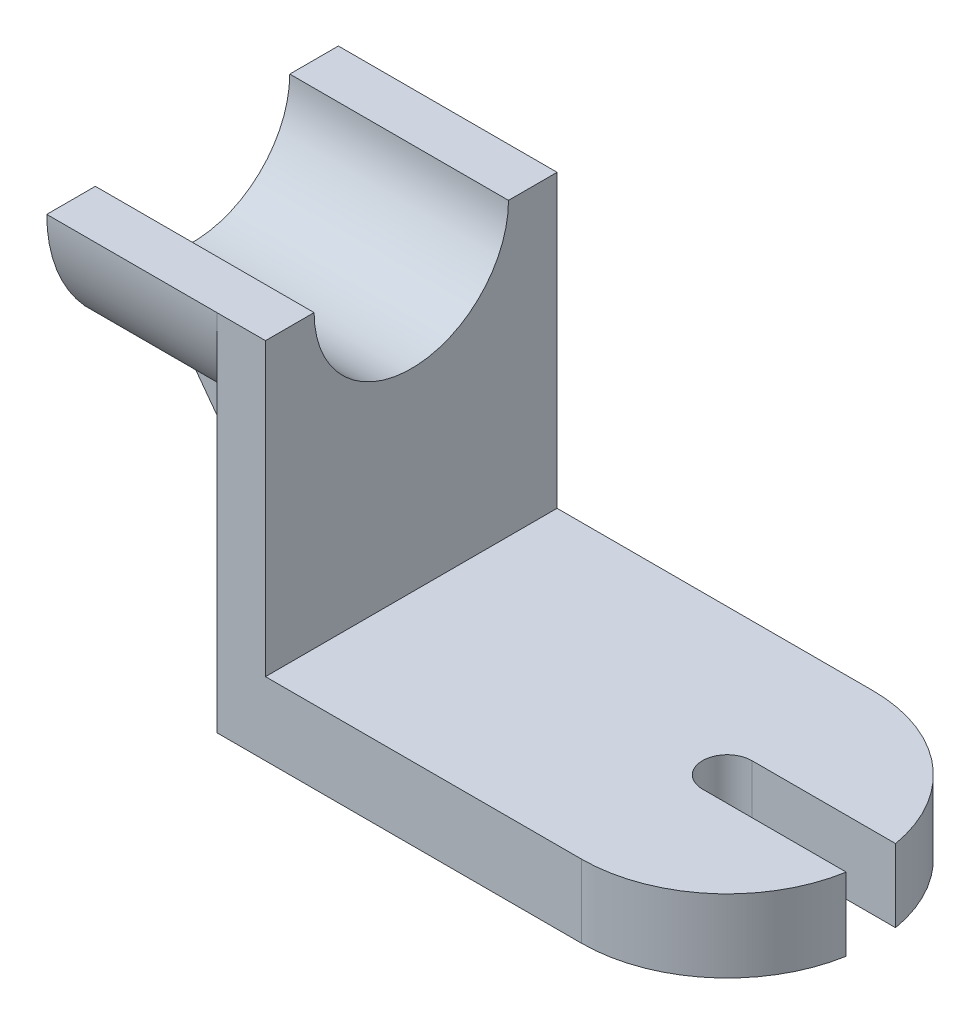
ISO-10303-21;
HEADER;
FILE_DESCRIPTION(('STEP AP214'),'2;1');
FILE_NAME('part.step','',(''),(''),'','','');
FILE_SCHEMA(('AUTOMOTIVE_DESIGN { 1 0 10303 214 1 1 1 1 }'));
ENDSEC;
DATA;
#1=APPLICATION_CONTEXT('core data for automotive mechanical design processes');
#2=APPLICATION_PROTOCOL_DEFINITION('international standard','automotive_design',2000,#1);
#3=PRODUCT_CONTEXT('',#1,'mechanical');
#4=PRODUCT('Part','Part','',(#3));
#5=PRODUCT_RELATED_PRODUCT_CATEGORY('part','',(#4));
#6=PRODUCT_DEFINITION_FORMATION('','',#4);
#7=PRODUCT_DEFINITION_CONTEXT('part definition',#1,'design');
#8=PRODUCT_DEFINITION('design','',#6,#7);
#9=PRODUCT_DEFINITION_SHAPE('','',#8);
#10=(LENGTH_UNIT() NAMED_UNIT(*) SI_UNIT(.MILLI.,.METRE.));
#11=(NAMED_UNIT(*) PLANE_ANGLE_UNIT() SI_UNIT($,.RADIAN.));
#12=(NAMED_UNIT(*) SI_UNIT($,.STERADIAN.) SOLID_ANGLE_UNIT());
#13=UNCERTAINTY_MEASURE_WITH_UNIT(LENGTH_MEASURE(1.E-05),#10,'distance_accuracy_value','');
#14=(GEOMETRIC_REPRESENTATION_CONTEXT(3) GLOBAL_UNCERTAINTY_ASSIGNED_CONTEXT((#13)) GLOBAL_UNIT_ASSIGNED_CONTEXT((#10,
#11,#12)) REPRESENTATION_CONTEXT('',''));
#15=CARTESIAN_POINT('',(0.,0.,0.));
#16=DIRECTION('',(0.,0.,1.));
#17=DIRECTION('',(1.,0.,0.));
#18=AXIS2_PLACEMENT_3D('',#15,#16,#17);
#19=CARTESIAN_POINT('',(-69.85,190.184169005967,-76.2));
#20=DIRECTION('',(0.,1.,0.));
#21=DIRECTION('',(0.,0.,1.));
#22=AXIS2_PLACEMENT_3D('',#19,#20,#21);
#23=PLANE('',#22);
#24=DIRECTION('',(1.,0.,0.));
#25=VECTOR('',#24,1.);
#26=CARTESIAN_POINT('',(-184.163180709959,190.184169005967,-50.8));
#27=LINE('',#26,#25);
#28=CARTESIAN_POINT('',(-184.163180709959,190.184169005967,-50.8));
#29=VERTEX_POINT('',#28);
#30=CARTESIAN_POINT('',(-69.85,190.184169005967,-50.8));
#31=VERTEX_POINT('',#30);
#32=EDGE_CURVE('E300',#29,#31,#27,.T.);
#33=ORIENTED_EDGE('',*,*,#32,.T.);
#34=DIRECTION('',(0.,0.,-1.));
#35=VECTOR('',#34,1.);
#36=CARTESIAN_POINT('',(-69.85,190.184169005967,-76.2));
#37=LINE('',#36,#35);
#38=CARTESIAN_POINT('',(-69.85,190.184169005967,-76.2));
#39=VERTEX_POINT('',#38);
#40=EDGE_CURVE('E172',#31,#39,#37,.T.);
#41=ORIENTED_EDGE('',*,*,#40,.T.);
#42=DIRECTION('',(-1.,0.,0.));
#43=VECTOR('',#42,1.);
#44=CARTESIAN_POINT('',(-69.85,190.184169005967,-76.2));
#45=LINE('',#44,#43);
#46=CARTESIAN_POINT('',(-95.25,190.184169005967,-76.2));
#47=VERTEX_POINT('',#46);
#48=EDGE_CURVE('E186',#39,#47,#45,.T.);
#49=ORIENTED_EDGE('',*,*,#48,.T.);
#50=DIRECTION('',(-1.,0.,0.));
#51=VECTOR('',#50,1.);
#52=CARTESIAN_POINT('',(-95.25,190.184169005967,-76.2));
#53=LINE('',#52,#51);
#54=CARTESIAN_POINT('',(-184.163180709959,190.184169005967,-76.2));
#55=VERTEX_POINT('',#54);
#56=EDGE_CURVE('E294',#47,#55,#53,.T.);
#57=ORIENTED_EDGE('',*,*,#56,.T.);
#58=DIRECTION('',(0.,0.,1.));
#59=VECTOR('',#58,1.);
#60=CARTESIAN_POINT('',(-184.163180709959,190.184169005967,-76.2));
#61=LINE('',#60,#59);
#62=EDGE_CURVE('E297',#55,#29,#61,.T.);
#63=ORIENTED_EDGE('',*,*,#62,.T.);
#64=EDGE_LOOP('',(#33,#41,#49,#57,#63));
#65=FACE_BOUND('',#64,.T.);
#66=ADVANCED_FACE('F32',(#65),#23,.T.);
#67=CARTESIAN_POINT('',(-95.25,38.1,76.2));
#68=DIRECTION('',(1.,0.,0.));
#69=DIRECTION('',(0.,0.,-1.));
#70=AXIS2_PLACEMENT_3D('',#67,#68,#69);
#71=PLANE('',#70);
#72=DIRECTION('',(0.,1.,0.));
#73=VECTOR('',#72,1.);
#74=CARTESIAN_POINT('',(-95.25,0.,12.902875399361));
#75=LINE('',#74,#73);
#76=CARTESIAN_POINT('',(-95.25,0.,12.9028753993611));
#77=VERTEX_POINT('',#76);
#78=CARTESIAN_POINT('',(-95.25,115.084529816231,12.9028753993613));
#79=VERTEX_POINT('',#78);
#80=EDGE_CURVE('E275',#77,#79,#75,.T.);
#81=ORIENTED_EDGE('',*,*,#80,.F.);
#82=DIRECTION('',(0.,0.,1.));
#83=VECTOR('',#82,1.);
#84=CARTESIAN_POINT('',(-95.25,0.,76.2));
#85=LINE('',#84,#83);
#86=CARTESIAN_POINT('',(-95.25,0.,76.2));
#87=VERTEX_POINT('',#86);
#88=EDGE_CURVE('E214',#77,#87,#85,.T.);
#89=ORIENTED_EDGE('',*,*,#88,.T.);
#90=DIRECTION('',(0.,-1.,0.));
#91=VECTOR('',#90,1.);
#92=CARTESIAN_POINT('',(-95.25,38.1,76.2));
#93=LINE('',#92,#91);
#94=CARTESIAN_POINT('',(-95.25,190.184169005967,76.2));
#95=VERTEX_POINT('',#94);
#96=EDGE_CURVE('E238',#95,#87,#93,.T.);
#97=ORIENTED_EDGE('',*,*,#96,.F.);
#98=CARTESIAN_POINT('',(-95.25,190.184169005967,0.));
#99=DIRECTION('',(1.,0.,0.));
#100=DIRECTION('',(0.,0.,-1.));
#101=AXIS2_PLACEMENT_3D('',#98,#99,#100);
#102=CIRCLE('',#101,76.2);
#103=EDGE_CURVE('E274',#95,#79,#102,.T.);
#104=ORIENTED_EDGE('',*,*,#103,.T.);
#105=EDGE_LOOP('',(#81,#89,#97,#104));
#106=FACE_BOUND('',#105,.T.);
#107=ADVANCED_FACE('F273',(#106),#71,.F.);
#108=DIRECTION('',(0.,-1.,0.));
#109=VECTOR('',#108,1.);
#110=CARTESIAN_POINT('',(-95.25,0.,-12.902875399361));
#111=LINE('',#110,#109);
#112=CARTESIAN_POINT('',(-95.25,115.084529816231,-12.902875399361));
#113=VERTEX_POINT('',#112);
#114=CARTESIAN_POINT('',(-95.25,0.,-12.902875399361));
#115=VERTEX_POINT('',#114);
#116=EDGE_CURVE('E277',#113,#115,#111,.T.);
#117=ORIENTED_EDGE('',*,*,#116,.F.);
#118=EDGE_CURVE('E308',#113,#47,#102,.T.);
#119=ORIENTED_EDGE('',*,*,#118,.T.);
#120=DIRECTION('',(0.,-1.,0.));
#121=VECTOR('',#120,1.);
#122=CARTESIAN_POINT('',(-95.25,38.1,-76.2));
#123=LINE('',#122,#121);
#124=CARTESIAN_POINT('',(-95.25,0.,-76.2));
#125=VERTEX_POINT('',#124);
#126=EDGE_CURVE('E241',#47,#125,#123,.T.);
#127=ORIENTED_EDGE('',*,*,#126,.T.);
#128=EDGE_CURVE('E215',#125,#115,#85,.T.);
#129=ORIENTED_EDGE('',*,*,#128,.T.);
#130=EDGE_LOOP('',(#117,#119,#127,#129));
#131=FACE_BOUND('',#130,.T.);
#132=ADVANCED_FACE('F312',(#131),#71,.F.);
#133=CARTESIAN_POINT('',(0.,190.184169005967,0.));
#134=DIRECTION('',(1.,0.,0.));
#135=DIRECTION('',(0.,0.,-1.));
#136=AXIS2_PLACEMENT_3D('',#133,#134,#135);
#137=CYLINDRICAL_SURFACE('',#136,76.2);
#138=CARTESIAN_POINT('',(-184.15,190.184169005967,0.));
#139=DIRECTION('',(-1.,0.,0.));
#140=DIRECTION('',(0.,0.,1.));
#141=AXIS2_PLACEMENT_3D('',#138,#139,#140);
#142=CIRCLE('',#141,76.2);
#143=CARTESIAN_POINT('',(-184.15,115.084529816231,12.902875399361));
#144=VERTEX_POINT('',#143);
#145=CARTESIAN_POINT('',(-184.15,115.084529816231,-12.902875399361));
#146=VERTEX_POINT('',#145);
#147=EDGE_CURVE('E247',#144,#146,#142,.F.);
#148=ORIENTED_EDGE('',*,*,#147,.F.);
#149=DIRECTION('',(1.,0.,0.));
#150=VECTOR('',#149,1.);
#151=CARTESIAN_POINT('',(-184.15,115.084529816231,12.902875399361));
#152=LINE('',#151,#150);
#153=EDGE_CURVE('E292',#144,#79,#152,.T.);
#154=ORIENTED_EDGE('',*,*,#153,.T.);
#155=ORIENTED_EDGE('',*,*,#103,.F.);
#156=DIRECTION('',(-1.,0.,0.));
#157=VECTOR('',#156,1.);
#158=CARTESIAN_POINT('',(-95.25,190.184169005967,76.2));
#159=LINE('',#158,#157);
#160=CARTESIAN_POINT('',(-184.163180709959,190.184169005967,76.2));
#161=VERTEX_POINT('',#160);
#162=EDGE_CURVE('E302',#95,#161,#159,.T.);
#163=ORIENTED_EDGE('',*,*,#162,.T.);
#164=CARTESIAN_POINT('',(-184.163180709959,190.184169005967,0.));
#165=DIRECTION('',(1.,0.,0.));
#166=DIRECTION('',(0.,0.,-1.));
#167=AXIS2_PLACEMENT_3D('',#164,#165,#166);
#168=CIRCLE('',#167,76.2);
#169=EDGE_CURVE('E307',#161,#55,#168,.T.);
#170=ORIENTED_EDGE('',*,*,#169,.T.);
#171=ORIENTED_EDGE('',*,*,#56,.F.);
#172=ORIENTED_EDGE('',*,*,#118,.F.);
#173=DIRECTION('',(1.,0.,0.));
#174=VECTOR('',#173,1.);
#175=CARTESIAN_POINT('',(-184.15,115.084529816231,-12.902875399361));
#176=LINE('',#175,#174);
#177=EDGE_CURVE('E289',#146,#113,#176,.T.);
#178=ORIENTED_EDGE('',*,*,#177,.F.);
#179=EDGE_LOOP('',(#148,#154,#155,#163,#170,#171,#172,#178));
#180=FACE_BOUND('',#179,.T.);
#181=ADVANCED_FACE('F322',(#180),#137,.T.);
#182=CARTESIAN_POINT('',(95.25,38.1,0.));
#183=DIRECTION('',(0.,-1.,0.));
#184=DIRECTION('',(0.,0.,-1.));
#185=AXIS2_PLACEMENT_3D('',#182,#183,#184);
#186=CYLINDRICAL_SURFACE('',#185,76.2);
#187=CARTESIAN_POINT('',(95.25,0.,0.));
#188=DIRECTION('',(0.,1.,0.));
#189=DIRECTION('',(0.,0.,1.));
#190=AXIS2_PLACEMENT_3D('',#187,#188,#189);
#191=CIRCLE('',#190,76.2);
#192=CARTESIAN_POINT('',(170.349639189736,0.,-12.902875399361));
#193=VERTEX_POINT('',#192);
#194=CARTESIAN_POINT('',(95.25,0.,-76.2));
#195=VERTEX_POINT('',#194);
#196=EDGE_CURVE('E193',#193,#195,#191,.T.);
#197=ORIENTED_EDGE('',*,*,#196,.T.);
#198=DIRECTION('',(0.,-1.,0.));
#199=VECTOR('',#198,1.);
#200=CARTESIAN_POINT('',(95.25,38.1,-76.2));
#201=LINE('',#200,#199);
#202=CARTESIAN_POINT('',(95.25,38.1,-76.2));
#203=VERTEX_POINT('',#202);
#204=EDGE_CURVE('E244',#203,#195,#201,.T.);
#205=ORIENTED_EDGE('',*,*,#204,.F.);
#206=CARTESIAN_POINT('',(95.25,38.1,0.));
#207=DIRECTION('',(0.,1.,0.));
#208=DIRECTION('',(0.,0.,1.));
#209=AXIS2_PLACEMENT_3D('',#206,#207,#208);
#210=CIRCLE('',#209,76.2);
#211=CARTESIAN_POINT('',(170.349639189736,38.1,-12.902875399361));
#212=VERTEX_POINT('',#211);
#213=EDGE_CURVE('E194',#212,#203,#210,.T.);
#214=ORIENTED_EDGE('',*,*,#213,.F.);
#215=DIRECTION('',(0.,-1.,0.));
#216=VECTOR('',#215,1.);
#217=CARTESIAN_POINT('',(170.349639189736,38.1,-12.902875399361));
#218=LINE('',#217,#216);
#219=EDGE_CURVE('E209',#212,#193,#218,.T.);
#220=ORIENTED_EDGE('',*,*,#219,.T.);
#221=EDGE_LOOP('',(#197,#205,#214,#220));
#222=FACE_BOUND('',#221,.T.);
#223=ADVANCED_FACE('F34',(#222),#186,.T.);
#224=CARTESIAN_POINT('',(-95.25,38.1,-76.2));
#225=DIRECTION('',(0.,0.,1.));
#226=DIRECTION('',(1.,0.,0.));
#227=AXIS2_PLACEMENT_3D('',#224,#225,#226);
#228=PLANE('',#227);
#229=DIRECTION('',(-1.,0.,0.));
#230=VECTOR('',#229,1.);
#231=CARTESIAN_POINT('',(-95.25,0.,-76.2));
#232=LINE('',#231,#230);
#233=EDGE_CURVE('E212',#195,#125,#232,.T.);
#234=ORIENTED_EDGE('',*,*,#233,.T.);
#235=ORIENTED_EDGE('',*,*,#126,.F.);
#236=ORIENTED_EDGE('',*,*,#48,.F.);
#237=DIRECTION('',(0.,-1.,0.));
#238=VECTOR('',#237,1.);
#239=CARTESIAN_POINT('',(-69.85,0.,-76.2));
#240=LINE('',#239,#238);
#241=CARTESIAN_POINT('',(-69.85,38.1,-76.2));
#242=VERTEX_POINT('',#241);
#243=EDGE_CURVE('E178',#39,#242,#240,.T.);
#244=ORIENTED_EDGE('',*,*,#243,.T.);
#245=DIRECTION('',(-1.,0.,0.));
#246=VECTOR('',#245,1.);
#247=CARTESIAN_POINT('',(-95.25,38.1,-76.2));
#248=LINE('',#247,#246);
#249=EDGE_CURVE('E197',#203,#242,#248,.T.);
#250=ORIENTED_EDGE('',*,*,#249,.F.);
#251=ORIENTED_EDGE('',*,*,#204,.T.);
#252=EDGE_LOOP('',(#234,#235,#236,#244,#250,#251));
#253=FACE_BOUND('',#252,.T.);
#254=ADVANCED_FACE('F318',(#253),#228,.F.);
#255=CARTESIAN_POINT('',(-95.25,38.1,76.2));
#256=DIRECTION('',(0.,0.,-1.));
#257=DIRECTION('',(-1.,0.,0.));
#258=AXIS2_PLACEMENT_3D('',#255,#256,#257);
#259=PLANE('',#258);
#260=DIRECTION('',(1.,0.,0.));
#261=VECTOR('',#260,1.);
#262=CARTESIAN_POINT('',(-95.25,38.1,76.2));
#263=LINE('',#262,#261);
#264=CARTESIAN_POINT('',(-69.85,38.1,76.2));
#265=VERTEX_POINT('',#264);
#266=CARTESIAN_POINT('',(95.25,38.1,76.2));
#267=VERTEX_POINT('',#266);
#268=EDGE_CURVE('E200',#265,#267,#263,.T.);
#269=ORIENTED_EDGE('',*,*,#268,.F.);
#270=DIRECTION('',(0.,1.,0.));
#271=VECTOR('',#270,1.);
#272=CARTESIAN_POINT('',(-69.85,190.184169005967,76.2));
#273=LINE('',#272,#271);
#274=CARTESIAN_POINT('',(-69.85,190.184169005967,76.2));
#275=VERTEX_POINT('',#274);
#276=EDGE_CURVE('E182',#265,#275,#273,.T.);
#277=ORIENTED_EDGE('',*,*,#276,.T.);
#278=DIRECTION('',(-1.,0.,0.));
#279=VECTOR('',#278,1.);
#280=CARTESIAN_POINT('',(-69.85,190.184169005967,76.2));
#281=LINE('',#280,#279);
#282=EDGE_CURVE('E177',#275,#95,#281,.T.);
#283=ORIENTED_EDGE('',*,*,#282,.T.);
#284=ORIENTED_EDGE('',*,*,#96,.T.);
#285=DIRECTION('',(1.,0.,0.));
#286=VECTOR('',#285,1.);
#287=CARTESIAN_POINT('',(-95.25,0.,76.2));
#288=LINE('',#287,#286);
#289=CARTESIAN_POINT('',(95.25,0.,76.2));
#290=VERTEX_POINT('',#289);
#291=EDGE_CURVE('E217',#87,#290,#288,.T.);
#292=ORIENTED_EDGE('',*,*,#291,.T.);
#293=DIRECTION('',(0.,-1.,0.));
#294=VECTOR('',#293,1.);
#295=CARTESIAN_POINT('',(95.25,38.1,76.2));
#296=LINE('',#295,#294);
#297=EDGE_CURVE('E235',#267,#290,#296,.T.);
#298=ORIENTED_EDGE('',*,*,#297,.F.);
#299=EDGE_LOOP('',(#269,#277,#283,#284,#292,#298));
#300=FACE_BOUND('',#299,.T.);
#301=ADVANCED_FACE('F269',(#300),#259,.F.);
#302=CARTESIAN_POINT('',(95.25,38.1,0.));
#303=DIRECTION('',(0.,-1.,0.));
#304=DIRECTION('',(0.,0.,-1.));
#305=AXIS2_PLACEMENT_3D('',#302,#303,#304);
#306=CYLINDRICAL_SURFACE('',#305,76.2);
#307=CARTESIAN_POINT('',(95.25,0.,0.));
#308=DIRECTION('',(0.,1.,0.));
#309=DIRECTION('',(0.,0.,1.));
#310=AXIS2_PLACEMENT_3D('',#307,#308,#309);
#311=CIRCLE('',#310,76.2);
#312=CARTESIAN_POINT('',(170.349639189736,0.,12.9028753993611));
#313=VERTEX_POINT('',#312);
#314=EDGE_CURVE('E219',#290,#313,#311,.T.);
#315=ORIENTED_EDGE('',*,*,#314,.T.);
#316=DIRECTION('',(0.,-1.,0.));
#317=VECTOR('',#316,1.);
#318=CARTESIAN_POINT('',(170.349639189736,38.1,12.9028753993611));
#319=LINE('',#318,#317);
#320=CARTESIAN_POINT('',(170.349639189736,38.1,12.9028753993611));
#321=VERTEX_POINT('',#320);
#322=EDGE_CURVE('E232',#321,#313,#319,.T.);
#323=ORIENTED_EDGE('',*,*,#322,.F.);
#324=CARTESIAN_POINT('',(95.25,38.1,0.));
#325=DIRECTION('',(0.,1.,0.));
#326=DIRECTION('',(0.,0.,1.));
#327=AXIS2_PLACEMENT_3D('',#324,#325,#326);
#328=CIRCLE('',#327,76.2);
#329=EDGE_CURVE('E202',#267,#321,#328,.T.);
#330=ORIENTED_EDGE('',*,*,#329,.F.);
#331=ORIENTED_EDGE('',*,*,#297,.T.);
#332=EDGE_LOOP('',(#315,#323,#330,#331));
#333=FACE_BOUND('',#332,.T.);
#334=ADVANCED_FACE('F263',(#333),#306,.T.);
#335=CARTESIAN_POINT('',(95.2500000000001,38.1,12.9028753993611));
#336=DIRECTION('',(0.,0.,1.));
#337=DIRECTION('',(1.,0.,0.));
#338=AXIS2_PLACEMENT_3D('',#335,#336,#337);
#339=PLANE('',#338);
#340=DIRECTION('',(-1.,0.,0.));
#341=VECTOR('',#340,1.);
#342=CARTESIAN_POINT('',(95.2500000000001,0.,12.9028753993611));
#343=LINE('',#342,#341);
#344=CARTESIAN_POINT('',(95.2500000000001,0.,12.9028753993611));
#345=VERTEX_POINT('',#344);
#346=EDGE_CURVE('E221',#313,#345,#343,.T.);
#347=ORIENTED_EDGE('',*,*,#346,.T.);
#348=DIRECTION('',(0.,-1.,0.));
#349=VECTOR('',#348,1.);
#350=CARTESIAN_POINT('',(95.2500000000001,38.1,12.9028753993611));
#351=LINE('',#350,#349);
#352=CARTESIAN_POINT('',(95.2500000000001,38.1,12.9028753993611));
#353=VERTEX_POINT('',#352);
#354=EDGE_CURVE('E230',#353,#345,#351,.T.);
#355=ORIENTED_EDGE('',*,*,#354,.F.);
#356=DIRECTION('',(-1.,0.,0.));
#357=VECTOR('',#356,1.);
#358=CARTESIAN_POINT('',(95.2500000000001,38.1,12.9028753993611));
#359=LINE('',#358,#357);
#360=EDGE_CURVE('E204',#321,#353,#359,.T.);
#361=ORIENTED_EDGE('',*,*,#360,.F.);
#362=ORIENTED_EDGE('',*,*,#322,.T.);
#363=EDGE_LOOP('',(#347,#355,#361,#362));
#364=FACE_BOUND('',#363,.T.);
#365=ADVANCED_FACE('F258',(#364),#339,.F.);
#366=CARTESIAN_POINT('',(95.25,38.1,-12.902875399361));
#367=DIRECTION('',(0.,0.,-1.));
#368=DIRECTION('',(-1.,0.,0.));
#369=AXIS2_PLACEMENT_3D('',#366,#367,#368);
#370=PLANE('',#369);
#371=DIRECTION('',(1.,0.,0.));
#372=VECTOR('',#371,1.);
#373=CARTESIAN_POINT('',(95.25,0.,-12.902875399361));
#374=LINE('',#373,#372);
#375=CARTESIAN_POINT('',(95.25,0.,-12.902875399361));
#376=VERTEX_POINT('',#375);
#377=EDGE_CURVE('E198',#376,#193,#374,.T.);
#378=ORIENTED_EDGE('',*,*,#377,.T.);
#379=ORIENTED_EDGE('',*,*,#219,.F.);
#380=DIRECTION('',(1.,0.,0.));
#381=VECTOR('',#380,1.);
#382=CARTESIAN_POINT('',(95.25,38.1,-12.902875399361));
#383=LINE('',#382,#381);
#384=CARTESIAN_POINT('',(95.25,38.1,-12.902875399361));
#385=VERTEX_POINT('',#384);
#386=EDGE_CURVE('E207',#385,#212,#383,.T.);
#387=ORIENTED_EDGE('',*,*,#386,.F.);
#388=DIRECTION('',(0.,-1.,0.));
#389=VECTOR('',#388,1.);
#390=CARTESIAN_POINT('',(95.25,38.1,-12.902875399361));
#391=LINE('',#390,#389);
#392=EDGE_CURVE('E227',#385,#376,#391,.T.);
#393=ORIENTED_EDGE('',*,*,#392,.T.);
#394=EDGE_LOOP('',(#378,#379,#387,#393));
#395=FACE_BOUND('',#394,.T.);
#396=ADVANCED_FACE('F351',(#395),#370,.F.);
#397=CARTESIAN_POINT('',(95.25,38.1,0.));
#398=DIRECTION('',(0.,1.,0.));
#399=DIRECTION('',(0.,0.,1.));
#400=AXIS2_PLACEMENT_3D('',#397,#398,#399);
#401=PLANE('',#400);
#402=CARTESIAN_POINT('',(95.25,38.1,0.));
#403=DIRECTION('',(0.,1.,0.));
#404=DIRECTION('',(0.,0.,1.));
#405=AXIS2_PLACEMENT_3D('',#402,#403,#404);
#406=CIRCLE('',#405,12.9028753993611);
#407=EDGE_CURVE('E375',#385,#353,#406,.T.);
#408=ORIENTED_EDGE('',*,*,#407,.F.);
#409=ORIENTED_EDGE('',*,*,#386,.T.);
#410=ORIENTED_EDGE('',*,*,#213,.T.);
#411=ORIENTED_EDGE('',*,*,#249,.T.);
#412=DIRECTION('',(0.,0.,-1.));
#413=VECTOR('',#412,1.);
#414=CARTESIAN_POINT('',(-69.85,38.1,0.));
#415=LINE('',#414,#413);
#416=EDGE_CURVE('E189',#265,#242,#415,.T.);
#417=ORIENTED_EDGE('',*,*,#416,.F.);
#418=ORIENTED_EDGE('',*,*,#268,.T.);
#419=ORIENTED_EDGE('',*,*,#329,.T.);
#420=ORIENTED_EDGE('',*,*,#360,.T.);
#421=EDGE_LOOP('',(#408,#409,#410,#411,#417,#418,#419,#420));
#422=FACE_BOUND('',#421,.T.);
#423=ADVANCED_FACE('F346',(#422),#401,.T.);
#424=CARTESIAN_POINT('',(95.25,0.,0.));
#425=DIRECTION('',(0.,1.,0.));
#426=DIRECTION('',(0.,0.,1.));
#427=AXIS2_PLACEMENT_3D('',#424,#425,#426);
#428=PLANE('',#427);
#429=ORIENTED_EDGE('',*,*,#377,.F.);
#430=CARTESIAN_POINT('',(95.25,0.,0.));
#431=DIRECTION('',(0.,1.,0.));
#432=DIRECTION('',(0.,0.,1.));
#433=AXIS2_PLACEMENT_3D('',#430,#431,#432);
#434=CIRCLE('',#433,12.9028753993611);
#435=EDGE_CURVE('E40',#376,#345,#434,.T.);
#436=ORIENTED_EDGE('',*,*,#435,.T.);
#437=ORIENTED_EDGE('',*,*,#346,.F.);
#438=ORIENTED_EDGE('',*,*,#314,.F.);
#439=ORIENTED_EDGE('',*,*,#291,.F.);
#440=ORIENTED_EDGE('',*,*,#88,.F.);
#441=DIRECTION('',(1.,0.,0.));
#442=VECTOR('',#441,1.);
#443=CARTESIAN_POINT('',(-184.15,0.,12.902875399361));
#444=LINE('',#443,#442);
#445=CARTESIAN_POINT('',(-98.8900757031352,0.,12.902875399361));
#446=VERTEX_POINT('',#445);
#447=EDGE_CURVE('E47',#446,#77,#444,.T.);
#448=ORIENTED_EDGE('',*,*,#447,.F.);
#449=DIRECTION('',(0.,0.,1.));
#450=VECTOR('',#449,1.);
#451=CARTESIAN_POINT('',(-98.8900757031352,0.,-75.997124600639));
#452=LINE('',#451,#450);
#453=CARTESIAN_POINT('',(-98.8900757031352,0.,-12.902875399361));
#454=VERTEX_POINT('',#453);
#455=EDGE_CURVE('E283',#454,#446,#452,.T.);
#456=ORIENTED_EDGE('',*,*,#455,.F.);
#457=DIRECTION('',(1.,0.,0.));
#458=VECTOR('',#457,1.);
#459=CARTESIAN_POINT('',(-184.15,0.,-12.902875399361));
#460=LINE('',#459,#458);
#461=EDGE_CURVE('E55',#454,#115,#460,.T.);
#462=ORIENTED_EDGE('',*,*,#461,.T.);
#463=ORIENTED_EDGE('',*,*,#128,.F.);
#464=ORIENTED_EDGE('',*,*,#233,.F.);
#465=ORIENTED_EDGE('',*,*,#196,.F.);
#466=EDGE_LOOP('',(#429,#436,#437,#438,#439,#440,#448,#456,#462,#463,#464,#465));
#467=FACE_BOUND('',#466,.T.);
#468=ADVANCED_FACE('F252',(#467),#428,.F.);
#469=CARTESIAN_POINT('',(-69.85,190.184169005967,50.8));
#470=VERTEX_POINT('',#469);
#471=EDGE_CURVE('E170',#275,#470,#37,.T.);
#472=ORIENTED_EDGE('',*,*,#471,.T.);
#473=DIRECTION('',(1.,0.,0.));
#474=VECTOR('',#473,1.);
#475=CARTESIAN_POINT('',(-184.163180709959,190.184169005967,50.8));
#476=LINE('',#475,#474);
#477=CARTESIAN_POINT('',(-184.163180709959,190.184169005967,50.8));
#478=VERTEX_POINT('',#477);
#479=EDGE_CURVE('E154',#478,#470,#476,.T.);
#480=ORIENTED_EDGE('',*,*,#479,.F.);
#481=DIRECTION('',(0.,0.,-1.));
#482=VECTOR('',#481,1.);
#483=CARTESIAN_POINT('',(-184.163180709959,190.184169005967,76.2));
#484=LINE('',#483,#482);
#485=EDGE_CURVE('E164',#161,#478,#484,.T.);
#486=ORIENTED_EDGE('',*,*,#485,.F.);
#487=ORIENTED_EDGE('',*,*,#162,.F.);
#488=ORIENTED_EDGE('',*,*,#282,.F.);
#489=EDGE_LOOP('',(#472,#480,#486,#487,#488));
#490=FACE_BOUND('',#489,.T.);
#491=ADVANCED_FACE('F174',(#490),#23,.T.);
#492=CARTESIAN_POINT('',(-69.85,0.,0.));
#493=DIRECTION('',(1.,0.,0.));
#494=DIRECTION('',(0.,0.,-1.));
#495=AXIS2_PLACEMENT_3D('',#492,#493,#494);
#496=PLANE('',#495);
#497=CARTESIAN_POINT('',(-69.85,190.184169005967,0.));
#498=DIRECTION('',(1.,0.,0.));
#499=DIRECTION('',(0.,0.,-1.));
#500=AXIS2_PLACEMENT_3D('',#497,#498,#499);
#501=CIRCLE('',#500,50.8);
#502=EDGE_CURVE('E11',#470,#31,#501,.T.);
#503=ORIENTED_EDGE('',*,*,#502,.F.);
#504=ORIENTED_EDGE('',*,*,#471,.F.);
#505=ORIENTED_EDGE('',*,*,#276,.F.);
#506=ORIENTED_EDGE('',*,*,#416,.T.);
#507=ORIENTED_EDGE('',*,*,#243,.F.);
#508=ORIENTED_EDGE('',*,*,#40,.F.);
#509=EDGE_LOOP('',(#503,#504,#505,#506,#507,#508));
#510=FACE_BOUND('',#509,.T.);
#511=ADVANCED_FACE('F168',(#510),#496,.T.);
#512=CARTESIAN_POINT('',(-184.163180709959,190.184169005967,76.2));
#513=DIRECTION('',(-1.,0.,0.));
#514=DIRECTION('',(0.,0.,1.));
#515=AXIS2_PLACEMENT_3D('',#512,#513,#514);
#516=PLANE('',#515);
#517=CARTESIAN_POINT('',(-184.163180709959,190.184169005967,0.));
#518=DIRECTION('',(1.,0.,0.));
#519=DIRECTION('',(0.,0.,-1.));
#520=AXIS2_PLACEMENT_3D('',#517,#518,#519);
#521=CIRCLE('',#520,50.8);
#522=EDGE_CURVE('E159',#478,#29,#521,.T.);
#523=ORIENTED_EDGE('',*,*,#522,.T.);
#524=ORIENTED_EDGE('',*,*,#62,.F.);
#525=ORIENTED_EDGE('',*,*,#169,.F.);
#526=ORIENTED_EDGE('',*,*,#485,.T.);
#527=EDGE_LOOP('',(#523,#524,#525,#526));
#528=FACE_BOUND('',#527,.T.);
#529=ADVANCED_FACE('F324',(#528),#516,.T.);
#530=CARTESIAN_POINT('',(0.,190.184169005967,0.));
#531=DIRECTION('',(1.,0.,0.));
#532=DIRECTION('',(0.,0.,-1.));
#533=AXIS2_PLACEMENT_3D('',#530,#531,#532);
#534=CYLINDRICAL_SURFACE('',#533,50.8);
#535=ORIENTED_EDGE('',*,*,#479,.T.);
#536=ORIENTED_EDGE('',*,*,#502,.T.);
#537=ORIENTED_EDGE('',*,*,#32,.F.);
#538=ORIENTED_EDGE('',*,*,#522,.F.);
#539=EDGE_LOOP('',(#535,#536,#537,#538));
#540=FACE_BOUND('',#539,.T.);
#541=ADVANCED_FACE('F156',(#540),#534,.F.);
#542=CARTESIAN_POINT('',(-184.15,0.,12.902875399361));
#543=DIRECTION('',(0.,0.,-1.));
#544=DIRECTION('',(-1.,0.,0.));
#545=AXIS2_PLACEMENT_3D('',#542,#543,#544);
#546=PLANE('',#545);
#547=ORIENTED_EDGE('',*,*,#153,.F.);
#548=DIRECTION('',(-0.595282209671218,0.80351670228375,0.));
#549=VECTOR('',#548,1.);
#550=CARTESIAN_POINT('',(-184.15,115.084529816231,12.902875399361));
#551=LINE('',#550,#549);
#552=EDGE_CURVE('E377',#446,#144,#551,.T.);
#553=ORIENTED_EDGE('',*,*,#552,.F.);
#554=ORIENTED_EDGE('',*,*,#447,.T.);
#555=ORIENTED_EDGE('',*,*,#80,.T.);
#556=EDGE_LOOP('',(#547,#553,#554,#555));
#557=FACE_BOUND('',#556,.T.);
#558=ADVANCED_FACE('F331',(#557),#546,.F.);
#559=CARTESIAN_POINT('',(-184.15,0.,-12.902875399361));
#560=DIRECTION('',(0.,0.,1.));
#561=DIRECTION('',(1.,0.,0.));
#562=AXIS2_PLACEMENT_3D('',#559,#560,#561);
#563=PLANE('',#562);
#564=ORIENTED_EDGE('',*,*,#461,.F.);
#565=DIRECTION('',(-0.595282209671218,0.80351670228375,0.));
#566=VECTOR('',#565,1.);
#567=CARTESIAN_POINT('',(-129.102859991122,40.7814586149003,-12.902875399361));
#568=LINE('',#567,#566);
#569=EDGE_CURVE('E278',#454,#146,#568,.T.);
#570=ORIENTED_EDGE('',*,*,#569,.T.);
#571=ORIENTED_EDGE('',*,*,#177,.T.);
#572=ORIENTED_EDGE('',*,*,#116,.T.);
#573=EDGE_LOOP('',(#564,#570,#571,#572));
#574=FACE_BOUND('',#573,.T.);
#575=ADVANCED_FACE('F388',(#574),#563,.F.);
#576=CARTESIAN_POINT('',(-184.15,0.,-75.997124600639));
#577=DIRECTION('',(-1.,0.,0.));
#578=DIRECTION('',(0.,0.,1.));
#579=AXIS2_PLACEMENT_3D('',#576,#577,#578);
#580=PLANE('',#579);
#581=ORIENTED_EDGE('',*,*,#147,.T.);
#582=DIRECTION('',(0.,0.,1.));
#583=VECTOR('',#582,1.);
#584=CARTESIAN_POINT('',(-184.15,115.084529816231,-75.997124600639));
#585=LINE('',#584,#583);
#586=EDGE_CURVE('E380',#146,#144,#585,.T.);
#587=ORIENTED_EDGE('',*,*,#586,.T.);
#588=EDGE_LOOP('',(#581,#587));
#589=FACE_BOUND('',#588,.T.);
#590=ADVANCED_FACE('F384',(#589),#580,.F.);
#591=CARTESIAN_POINT('',(-184.15,115.084529816231,-75.997124600639));
#592=DIRECTION('',(0.80351670228375,0.595282209671217,0.));
#593=DIRECTION('',(-0.595282209671218,0.80351670228375,0.));
#594=AXIS2_PLACEMENT_3D('',#591,#592,#593);
#595=PLANE('',#594);
#596=ORIENTED_EDGE('',*,*,#455,.T.);
#597=ORIENTED_EDGE('',*,*,#552,.T.);
#598=ORIENTED_EDGE('',*,*,#586,.F.);
#599=ORIENTED_EDGE('',*,*,#569,.F.);
#600=EDGE_LOOP('',(#596,#597,#598,#599));
#601=FACE_BOUND('',#600,.T.);
#602=ADVANCED_FACE('F386',(#601),#595,.F.);
#603=CARTESIAN_POINT('',(95.25,-50.8,0.));
#604=DIRECTION('',(0.,1.,0.));
#605=DIRECTION('',(0.,0.,1.));
#606=AXIS2_PLACEMENT_3D('',#603,#604,#605);
#607=CYLINDRICAL_SURFACE('',#606,12.9028753993611);
#608=ORIENTED_EDGE('',*,*,#435,.F.);
#609=ORIENTED_EDGE('',*,*,#392,.F.);
#610=ORIENTED_EDGE('',*,*,#407,.T.);
#611=ORIENTED_EDGE('',*,*,#354,.T.);
#612=EDGE_LOOP('',(#608,#609,#610,#611));
#613=FACE_BOUND('',#612,.T.);
#614=ADVANCED_FACE('F376',(#613),#607,.F.);
#615=CLOSED_SHELL('',(#66,#107,#132,#181,#223,#254,#301,#334,#365,#396,#423,#468,#491,#511,#529,
#541,#558,#575,#590,#602,#614));
#616=MANIFOLD_SOLID_BREP('B2',#615);
#617=ADVANCED_BREP_SHAPE_REPRESENTATION('',(#18,#616),#14);
#618=SHAPE_DEFINITION_REPRESENTATION(#9,#617);
ENDSEC;
END-ISO-10303-21;
